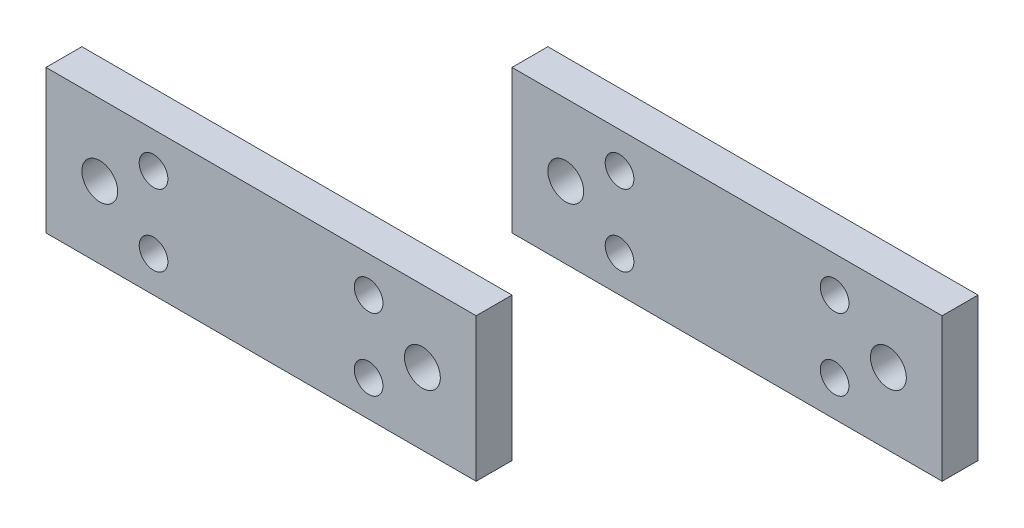
ISO-10303-21;
HEADER;
FILE_DESCRIPTION(('STEP AP214'),'2;1');
FILE_NAME('part.step','',(''),(''),'','','');
FILE_SCHEMA(('AUTOMOTIVE_DESIGN { 1 0 10303 214 1 1 1 1 }'));
ENDSEC;
DATA;
#1=APPLICATION_CONTEXT('core data for automotive mechanical design processes');
#2=APPLICATION_PROTOCOL_DEFINITION('international standard','automotive_design',2000,#1);
#3=PRODUCT_CONTEXT('',#1,'mechanical');
#4=PRODUCT('Part','Part','',(#3));
#5=PRODUCT_RELATED_PRODUCT_CATEGORY('part','',(#4));
#6=PRODUCT_DEFINITION_FORMATION('','',#4);
#7=PRODUCT_DEFINITION_CONTEXT('part definition',#1,'design');
#8=PRODUCT_DEFINITION('design','',#6,#7);
#9=PRODUCT_DEFINITION_SHAPE('','',#8);
#10=(LENGTH_UNIT() NAMED_UNIT(*) SI_UNIT(.MILLI.,.METRE.));
#11=(NAMED_UNIT(*) PLANE_ANGLE_UNIT() SI_UNIT($,.RADIAN.));
#12=(NAMED_UNIT(*) SI_UNIT($,.STERADIAN.) SOLID_ANGLE_UNIT());
#13=UNCERTAINTY_MEASURE_WITH_UNIT(LENGTH_MEASURE(1.E-05),#10,'distance_accuracy_value','');
#14=(GEOMETRIC_REPRESENTATION_CONTEXT(3) GLOBAL_UNCERTAINTY_ASSIGNED_CONTEXT((#13)) GLOBAL_UNIT_ASSIGNED_CONTEXT((#10,
#11,#12)) REPRESENTATION_CONTEXT('',''));
#15=CARTESIAN_POINT('',(0.,0.,0.));
#16=DIRECTION('',(0.,0.,1.));
#17=DIRECTION('',(1.,0.,0.));
#18=AXIS2_PLACEMENT_3D('',#15,#16,#17);
#19=CARTESIAN_POINT('',(0.,0.,2.));
#20=DIRECTION('',(0.,0.,1.));
#21=DIRECTION('',(1.,0.,0.));
#22=AXIS2_PLACEMENT_3D('',#19,#20,#21);
#23=PLANE('',#22);
#24=CARTESIAN_POINT('',(26.4999544809222,6.52037325431698,2.));
#25=DIRECTION('',(0.,0.,1.));
#26=DIRECTION('',(-1.,0.,0.));
#27=AXIS2_PLACEMENT_3D('',#24,#25,#26);
#28=CIRCLE('',#27,1.00000000000001);
#29=CARTESIAN_POINT('',(25.4999544809222,6.52037325431698,2.));
#30=VERTEX_POINT('',#29);
#31=EDGE_CURVE('E145',#30,#30,#28,.T.);
#32=ORIENTED_EDGE('',*,*,#31,.F.);
#33=EDGE_LOOP('',(#32));
#34=FACE_BOUND('',#33,.T.);
#35=CARTESIAN_POINT('',(11.4999544809222,4.52037325431698,2.));
#36=DIRECTION('',(0.,0.,1.));
#37=DIRECTION('',(-1.,0.,0.));
#38=AXIS2_PLACEMENT_3D('',#35,#36,#37);
#39=CIRCLE('',#38,0.800000000000002);
#40=CARTESIAN_POINT('',(10.6999544809222,4.52037325431698,2.));
#41=VERTEX_POINT('',#40);
#42=EDGE_CURVE('E133',#41,#41,#39,.T.);
#43=ORIENTED_EDGE('',*,*,#42,.F.);
#44=EDGE_LOOP('',(#43));
#45=FACE_BOUND('',#44,.T.);
#46=CARTESIAN_POINT('',(11.4999544809222,8.52037325431698,2.));
#47=DIRECTION('',(0.,0.,1.));
#48=DIRECTION('',(1.,0.,0.));
#49=AXIS2_PLACEMENT_3D('',#46,#47,#48);
#50=CIRCLE('',#49,0.800000000000001);
#51=CARTESIAN_POINT('',(12.2999544809222,8.52037325431698,2.));
#52=VERTEX_POINT('',#51);
#53=EDGE_CURVE('E112',#52,#52,#50,.T.);
#54=ORIENTED_EDGE('',*,*,#53,.F.);
#55=EDGE_LOOP('',(#54));
#56=FACE_BOUND('',#55,.T.);
#57=DIRECTION('',(0.,-1.,0.));
#58=VECTOR('',#57,1.);
#59=CARTESIAN_POINT('',(5.4999544809222,10.520373254317,2.));
#60=LINE('',#59,#58);
#61=CARTESIAN_POINT('',(5.4999544809222,10.520373254317,2.));
#62=VERTEX_POINT('',#61);
#63=CARTESIAN_POINT('',(5.4999544809222,2.52037325431698,2.));
#64=VERTEX_POINT('',#63);
#65=EDGE_CURVE('E97',#62,#64,#60,.T.);
#66=ORIENTED_EDGE('',*,*,#65,.T.);
#67=DIRECTION('',(1.,0.,0.));
#68=VECTOR('',#67,1.);
#69=CARTESIAN_POINT('',(5.4999544809222,2.52037325431698,2.));
#70=LINE('',#69,#68);
#71=CARTESIAN_POINT('',(29.4999544809222,2.52037325431698,2.));
#72=VERTEX_POINT('',#71);
#73=EDGE_CURVE('E92',#64,#72,#70,.T.);
#74=ORIENTED_EDGE('',*,*,#73,.T.);
#75=DIRECTION('',(0.,1.,0.));
#76=VECTOR('',#75,1.);
#77=CARTESIAN_POINT('',(29.4999544809222,10.520373254317,2.));
#78=LINE('',#77,#76);
#79=CARTESIAN_POINT('',(29.4999544809222,10.520373254317,2.));
#80=VERTEX_POINT('',#79);
#81=EDGE_CURVE('E95',#72,#80,#78,.T.);
#82=ORIENTED_EDGE('',*,*,#81,.T.);
#83=DIRECTION('',(-1.,0.,0.));
#84=VECTOR('',#83,1.);
#85=CARTESIAN_POINT('',(5.4999544809222,10.520373254317,2.));
#86=LINE('',#85,#84);
#87=EDGE_CURVE('E62',#80,#62,#86,.T.);
#88=ORIENTED_EDGE('',*,*,#87,.T.);
#89=EDGE_LOOP('',(#66,#74,#82,#88));
#90=FACE_BOUND('',#89,.T.);
#91=CARTESIAN_POINT('',(8.4999544809222,6.52037325431698,2.));
#92=DIRECTION('',(0.,0.,1.));
#93=DIRECTION('',(1.,0.,0.));
#94=AXIS2_PLACEMENT_3D('',#91,#92,#93);
#95=CIRCLE('',#94,1.);
#96=CARTESIAN_POINT('',(9.4999544809222,6.52037325431698,2.));
#97=VERTEX_POINT('',#96);
#98=EDGE_CURVE('E127',#97,#97,#95,.T.);
#99=ORIENTED_EDGE('',*,*,#98,.F.);
#100=EDGE_LOOP('',(#99));
#101=FACE_BOUND('',#100,.T.);
#102=CARTESIAN_POINT('',(23.4999544809222,4.52037325431698,2.));
#103=DIRECTION('',(0.,0.,1.));
#104=DIRECTION('',(1.,0.,0.));
#105=AXIS2_PLACEMENT_3D('',#102,#103,#104);
#106=CIRCLE('',#105,0.800000000000002);
#107=CARTESIAN_POINT('',(24.2999544809222,4.52037325431698,2.));
#108=VERTEX_POINT('',#107);
#109=EDGE_CURVE('E139',#108,#108,#106,.T.);
#110=ORIENTED_EDGE('',*,*,#109,.F.);
#111=EDGE_LOOP('',(#110));
#112=FACE_BOUND('',#111,.T.);
#113=CARTESIAN_POINT('',(23.4999544809222,8.52037325431698,2.));
#114=DIRECTION('',(0.,0.,1.));
#115=DIRECTION('',(-1.,0.,0.));
#116=AXIS2_PLACEMENT_3D('',#113,#114,#115);
#117=CIRCLE('',#116,0.800000000000002);
#118=CARTESIAN_POINT('',(22.6999544809222,8.52037325431698,2.));
#119=VERTEX_POINT('',#118);
#120=EDGE_CURVE('E151',#119,#119,#117,.T.);
#121=ORIENTED_EDGE('',*,*,#120,.F.);
#122=EDGE_LOOP('',(#121));
#123=FACE_BOUND('',#122,.T.);
#124=ADVANCED_FACE('F45',(#34,#45,#56,#90,#101,#112,#123),#23,.T.);
#125=CARTESIAN_POINT('',(0.,0.,0.));
#126=DIRECTION('',(0.,0.,1.));
#127=DIRECTION('',(1.,0.,0.));
#128=AXIS2_PLACEMENT_3D('',#125,#126,#127);
#129=PLANE('',#128);
#130=DIRECTION('',(0.,-1.,0.));
#131=VECTOR('',#130,1.);
#132=CARTESIAN_POINT('',(5.4999544809222,10.520373254317,0.));
#133=LINE('',#132,#131);
#134=CARTESIAN_POINT('',(5.4999544809222,10.520373254317,0.));
#135=VERTEX_POINT('',#134);
#136=CARTESIAN_POINT('',(5.4999544809222,2.52037325431698,0.));
#137=VERTEX_POINT('',#136);
#138=EDGE_CURVE('E109',#135,#137,#133,.T.);
#139=ORIENTED_EDGE('',*,*,#138,.F.);
#140=DIRECTION('',(-1.,0.,0.));
#141=VECTOR('',#140,1.);
#142=CARTESIAN_POINT('',(5.4999544809222,10.520373254317,0.));
#143=LINE('',#142,#141);
#144=CARTESIAN_POINT('',(29.4999544809222,10.520373254317,0.));
#145=VERTEX_POINT('',#144);
#146=EDGE_CURVE('E85',#145,#135,#143,.T.);
#147=ORIENTED_EDGE('',*,*,#146,.F.);
#148=DIRECTION('',(0.,1.,0.));
#149=VECTOR('',#148,1.);
#150=CARTESIAN_POINT('',(29.4999544809222,10.520373254317,0.));
#151=LINE('',#150,#149);
#152=CARTESIAN_POINT('',(29.4999544809222,2.52037325431698,0.));
#153=VERTEX_POINT('',#152);
#154=EDGE_CURVE('E79',#153,#145,#151,.T.);
#155=ORIENTED_EDGE('',*,*,#154,.F.);
#156=DIRECTION('',(1.,0.,0.));
#157=VECTOR('',#156,1.);
#158=CARTESIAN_POINT('',(5.4999544809222,2.52037325431698,0.));
#159=LINE('',#158,#157);
#160=EDGE_CURVE('E101',#137,#153,#159,.T.);
#161=ORIENTED_EDGE('',*,*,#160,.F.);
#162=EDGE_LOOP('',(#139,#147,#155,#161));
#163=FACE_BOUND('',#162,.T.);
#164=CARTESIAN_POINT('',(11.4999544809222,8.52037325431698,0.));
#165=DIRECTION('',(0.,0.,1.));
#166=DIRECTION('',(1.,0.,0.));
#167=AXIS2_PLACEMENT_3D('',#164,#165,#166);
#168=CIRCLE('',#167,0.800000000000001);
#169=CARTESIAN_POINT('',(12.2999544809222,8.52037325431698,0.));
#170=VERTEX_POINT('',#169);
#171=EDGE_CURVE('E124',#170,#170,#168,.T.);
#172=ORIENTED_EDGE('',*,*,#171,.T.);
#173=EDGE_LOOP('',(#172));
#174=FACE_BOUND('',#173,.T.);
#175=CARTESIAN_POINT('',(8.4999544809222,6.52037325431698,0.));
#176=DIRECTION('',(0.,0.,1.));
#177=DIRECTION('',(1.,0.,0.));
#178=AXIS2_PLACEMENT_3D('',#175,#176,#177);
#179=CIRCLE('',#178,1.);
#180=CARTESIAN_POINT('',(9.4999544809222,6.52037325431698,0.));
#181=VERTEX_POINT('',#180);
#182=EDGE_CURVE('E130',#181,#181,#179,.T.);
#183=ORIENTED_EDGE('',*,*,#182,.T.);
#184=EDGE_LOOP('',(#183));
#185=FACE_BOUND('',#184,.T.);
#186=CARTESIAN_POINT('',(11.4999544809222,4.52037325431698,0.));
#187=DIRECTION('',(0.,0.,1.));
#188=DIRECTION('',(-1.,0.,0.));
#189=AXIS2_PLACEMENT_3D('',#186,#187,#188);
#190=CIRCLE('',#189,0.800000000000002);
#191=CARTESIAN_POINT('',(10.6999544809222,4.52037325431698,0.));
#192=VERTEX_POINT('',#191);
#193=EDGE_CURVE('E136',#192,#192,#190,.T.);
#194=ORIENTED_EDGE('',*,*,#193,.T.);
#195=EDGE_LOOP('',(#194));
#196=FACE_BOUND('',#195,.T.);
#197=CARTESIAN_POINT('',(23.4999544809222,4.52037325431698,0.));
#198=DIRECTION('',(0.,0.,1.));
#199=DIRECTION('',(1.,0.,0.));
#200=AXIS2_PLACEMENT_3D('',#197,#198,#199);
#201=CIRCLE('',#200,0.800000000000002);
#202=CARTESIAN_POINT('',(24.2999544809222,4.52037325431698,0.));
#203=VERTEX_POINT('',#202);
#204=EDGE_CURVE('E142',#203,#203,#201,.T.);
#205=ORIENTED_EDGE('',*,*,#204,.T.);
#206=EDGE_LOOP('',(#205));
#207=FACE_BOUND('',#206,.T.);
#208=CARTESIAN_POINT('',(26.4999544809222,6.52037325431698,0.));
#209=DIRECTION('',(0.,0.,1.));
#210=DIRECTION('',(-1.,0.,0.));
#211=AXIS2_PLACEMENT_3D('',#208,#209,#210);
#212=CIRCLE('',#211,1.00000000000001);
#213=CARTESIAN_POINT('',(25.4999544809222,6.52037325431698,0.));
#214=VERTEX_POINT('',#213);
#215=EDGE_CURVE('E148',#214,#214,#212,.T.);
#216=ORIENTED_EDGE('',*,*,#215,.T.);
#217=EDGE_LOOP('',(#216));
#218=FACE_BOUND('',#217,.T.);
#219=CARTESIAN_POINT('',(23.4999544809222,8.52037325431698,0.));
#220=DIRECTION('',(0.,0.,1.));
#221=DIRECTION('',(-1.,0.,0.));
#222=AXIS2_PLACEMENT_3D('',#219,#220,#221);
#223=CIRCLE('',#222,0.800000000000002);
#224=CARTESIAN_POINT('',(22.6999544809222,8.52037325431698,0.));
#225=VERTEX_POINT('',#224);
#226=EDGE_CURVE('E154',#225,#225,#223,.T.);
#227=ORIENTED_EDGE('',*,*,#226,.T.);
#228=EDGE_LOOP('',(#227));
#229=FACE_BOUND('',#228,.T.);
#230=ADVANCED_FACE('F120',(#163,#174,#185,#196,#207,#218,#229),#129,.F.);
#231=CARTESIAN_POINT('',(5.4999544809222,10.520373254317,2.));
#232=DIRECTION('',(1.,0.,0.));
#233=DIRECTION('',(0.,1.,0.));
#234=AXIS2_PLACEMENT_3D('',#231,#232,#233);
#235=PLANE('',#234);
#236=ORIENTED_EDGE('',*,*,#138,.T.);
#237=DIRECTION('',(0.,0.,-1.));
#238=VECTOR('',#237,1.);
#239=CARTESIAN_POINT('',(5.4999544809222,2.52037325431698,2.));
#240=LINE('',#239,#238);
#241=EDGE_CURVE('E12',#64,#137,#240,.T.);
#242=ORIENTED_EDGE('',*,*,#241,.F.);
#243=ORIENTED_EDGE('',*,*,#65,.F.);
#244=DIRECTION('',(0.,0.,-1.));
#245=VECTOR('',#244,1.);
#246=CARTESIAN_POINT('',(5.4999544809222,10.520373254317,2.));
#247=LINE('',#246,#245);
#248=EDGE_CURVE('E105',#62,#135,#247,.T.);
#249=ORIENTED_EDGE('',*,*,#248,.T.);
#250=EDGE_LOOP('',(#236,#242,#243,#249));
#251=FACE_BOUND('',#250,.T.);
#252=ADVANCED_FACE('F47',(#251),#235,.F.);
#253=CARTESIAN_POINT('',(5.4999544809222,2.52037325431698,2.));
#254=DIRECTION('',(0.,1.,0.));
#255=DIRECTION('',(-1.,0.,0.));
#256=AXIS2_PLACEMENT_3D('',#253,#254,#255);
#257=PLANE('',#256);
#258=ORIENTED_EDGE('',*,*,#160,.T.);
#259=DIRECTION('',(0.,0.,-1.));
#260=VECTOR('',#259,1.);
#261=CARTESIAN_POINT('',(29.4999544809222,2.52037325431698,2.));
#262=LINE('',#261,#260);
#263=EDGE_CURVE('E54',#72,#153,#262,.T.);
#264=ORIENTED_EDGE('',*,*,#263,.F.);
#265=ORIENTED_EDGE('',*,*,#73,.F.);
#266=ORIENTED_EDGE('',*,*,#241,.T.);
#267=EDGE_LOOP('',(#258,#264,#265,#266));
#268=FACE_BOUND('',#267,.T.);
#269=ADVANCED_FACE('F100',(#268),#257,.F.);
#270=CARTESIAN_POINT('',(29.4999544809222,10.520373254317,2.));
#271=DIRECTION('',(-1.,0.,0.));
#272=DIRECTION('',(0.,0.,1.));
#273=AXIS2_PLACEMENT_3D('',#270,#271,#272);
#274=PLANE('',#273);
#275=ORIENTED_EDGE('',*,*,#154,.T.);
#276=DIRECTION('',(0.,0.,-1.));
#277=VECTOR('',#276,1.);
#278=CARTESIAN_POINT('',(29.4999544809222,10.520373254317,2.));
#279=LINE('',#278,#277);
#280=EDGE_CURVE('E102',#80,#145,#279,.T.);
#281=ORIENTED_EDGE('',*,*,#280,.F.);
#282=ORIENTED_EDGE('',*,*,#81,.F.);
#283=ORIENTED_EDGE('',*,*,#263,.T.);
#284=EDGE_LOOP('',(#275,#281,#282,#283));
#285=FACE_BOUND('',#284,.T.);
#286=ADVANCED_FACE('F103',(#285),#274,.F.);
#287=CARTESIAN_POINT('',(5.4999544809222,10.520373254317,2.));
#288=DIRECTION('',(0.,-1.,0.));
#289=DIRECTION('',(1.,0.,0.));
#290=AXIS2_PLACEMENT_3D('',#287,#288,#289);
#291=PLANE('',#290);
#292=ORIENTED_EDGE('',*,*,#146,.T.);
#293=ORIENTED_EDGE('',*,*,#248,.F.);
#294=ORIENTED_EDGE('',*,*,#87,.F.);
#295=ORIENTED_EDGE('',*,*,#280,.T.);
#296=EDGE_LOOP('',(#292,#293,#294,#295));
#297=FACE_BOUND('',#296,.T.);
#298=ADVANCED_FACE('F117',(#297),#291,.F.);
#299=CARTESIAN_POINT('',(11.4999544809222,8.52037325431698,2.));
#300=DIRECTION('',(0.,0.,-1.));
#301=DIRECTION('',(-1.,0.,0.));
#302=AXIS2_PLACEMENT_3D('',#299,#300,#301);
#303=CYLINDRICAL_SURFACE('',#302,0.800000000000001);
#304=ORIENTED_EDGE('',*,*,#53,.T.);
#305=EDGE_LOOP('',(#304));
#306=FACE_BOUND('',#305,.T.);
#307=ORIENTED_EDGE('',*,*,#171,.F.);
#308=EDGE_LOOP('',(#307));
#309=FACE_BOUND('',#308,.T.);
#310=ADVANCED_FACE('F173',(#306,#309),#303,.F.);
#311=CARTESIAN_POINT('',(8.4999544809222,6.52037325431698,2.));
#312=DIRECTION('',(0.,0.,-1.));
#313=DIRECTION('',(-1.,0.,0.));
#314=AXIS2_PLACEMENT_3D('',#311,#312,#313);
#315=CYLINDRICAL_SURFACE('',#314,1.);
#316=ORIENTED_EDGE('',*,*,#98,.T.);
#317=EDGE_LOOP('',(#316));
#318=FACE_BOUND('',#317,.T.);
#319=ORIENTED_EDGE('',*,*,#182,.F.);
#320=EDGE_LOOP('',(#319));
#321=FACE_BOUND('',#320,.T.);
#322=ADVANCED_FACE('F219',(#318,#321),#315,.F.);
#323=CARTESIAN_POINT('',(11.4999544809222,4.52037325431698,2.));
#324=DIRECTION('',(0.,0.,-1.));
#325=DIRECTION('',(-1.,0.,0.));
#326=AXIS2_PLACEMENT_3D('',#323,#324,#325);
#327=CYLINDRICAL_SURFACE('',#326,0.800000000000002);
#328=ORIENTED_EDGE('',*,*,#42,.T.);
#329=EDGE_LOOP('',(#328));
#330=FACE_BOUND('',#329,.T.);
#331=ORIENTED_EDGE('',*,*,#193,.F.);
#332=EDGE_LOOP('',(#331));
#333=FACE_BOUND('',#332,.T.);
#334=ADVANCED_FACE('F227',(#330,#333),#327,.F.);
#335=CARTESIAN_POINT('',(23.4999544809222,4.52037325431698,2.));
#336=DIRECTION('',(0.,0.,-1.));
#337=DIRECTION('',(-1.,0.,0.));
#338=AXIS2_PLACEMENT_3D('',#335,#336,#337);
#339=CYLINDRICAL_SURFACE('',#338,0.800000000000002);
#340=ORIENTED_EDGE('',*,*,#109,.T.);
#341=EDGE_LOOP('',(#340));
#342=FACE_BOUND('',#341,.T.);
#343=ORIENTED_EDGE('',*,*,#204,.F.);
#344=EDGE_LOOP('',(#343));
#345=FACE_BOUND('',#344,.T.);
#346=ADVANCED_FACE('F235',(#342,#345),#339,.F.);
#347=CARTESIAN_POINT('',(26.4999544809222,6.52037325431698,2.));
#348=DIRECTION('',(0.,0.,-1.));
#349=DIRECTION('',(-1.,0.,0.));
#350=AXIS2_PLACEMENT_3D('',#347,#348,#349);
#351=CYLINDRICAL_SURFACE('',#350,1.00000000000001);
#352=ORIENTED_EDGE('',*,*,#31,.T.);
#353=EDGE_LOOP('',(#352));
#354=FACE_BOUND('',#353,.T.);
#355=ORIENTED_EDGE('',*,*,#215,.F.);
#356=EDGE_LOOP('',(#355));
#357=FACE_BOUND('',#356,.T.);
#358=ADVANCED_FACE('F244',(#354,#357),#351,.F.);
#359=CARTESIAN_POINT('',(23.4999544809222,8.52037325431698,2.));
#360=DIRECTION('',(0.,0.,-1.));
#361=DIRECTION('',(-1.,0.,0.));
#362=AXIS2_PLACEMENT_3D('',#359,#360,#361);
#363=CYLINDRICAL_SURFACE('',#362,0.800000000000002);
#364=ORIENTED_EDGE('',*,*,#120,.T.);
#365=EDGE_LOOP('',(#364));
#366=FACE_BOUND('',#365,.T.);
#367=ORIENTED_EDGE('',*,*,#226,.F.);
#368=EDGE_LOOP('',(#367));
#369=FACE_BOUND('',#368,.T.);
#370=ADVANCED_FACE('F160',(#366,#369),#363,.F.);
#371=CLOSED_SHELL('',(#124,#230,#252,#269,#286,#298,#310,#322,#334,#346,#358,#370));
#372=MANIFOLD_SOLID_BREP('B2',#371);
#373=CARTESIAN_POINT('',(0.,0.,2.));
#374=DIRECTION('',(0.,0.,1.));
#375=DIRECTION('',(1.,0.,0.));
#376=AXIS2_PLACEMENT_3D('',#373,#374,#375);
#377=PLANE('',#376);
#378=CARTESIAN_POINT('',(0.499954480922202,-6.47962674568302,2.));
#379=DIRECTION('',(0.,0.,1.));
#380=DIRECTION('',(-1.,0.,0.));
#381=AXIS2_PLACEMENT_3D('',#378,#379,#380);
#382=CIRCLE('',#381,1.00000000000001);
#383=CARTESIAN_POINT('',(-0.500045519077807,-6.47962674568302,2.));
#384=VERTEX_POINT('',#383);
#385=EDGE_CURVE('E395',#384,#384,#382,.T.);
#386=ORIENTED_EDGE('',*,*,#385,.F.);
#387=EDGE_LOOP('',(#386));
#388=FACE_BOUND('',#387,.T.);
#389=CARTESIAN_POINT('',(-14.5000455190778,-8.47962674568302,2.));
#390=DIRECTION('',(0.,0.,1.));
#391=DIRECTION('',(-1.,0.,0.));
#392=AXIS2_PLACEMENT_3D('',#389,#390,#391);
#393=CIRCLE('',#392,0.800000000000002);
#394=CARTESIAN_POINT('',(-15.3000455190778,-8.47962674568302,2.));
#395=VERTEX_POINT('',#394);
#396=EDGE_CURVE('E383',#395,#395,#393,.T.);
#397=ORIENTED_EDGE('',*,*,#396,.F.);
#398=EDGE_LOOP('',(#397));
#399=FACE_BOUND('',#398,.T.);
#400=CARTESIAN_POINT('',(-14.5000455190778,-4.47962674568302,2.));
#401=DIRECTION('',(0.,0.,1.));
#402=DIRECTION('',(1.,0.,0.));
#403=AXIS2_PLACEMENT_3D('',#400,#401,#402);
#404=CIRCLE('',#403,0.800000000000001);
#405=CARTESIAN_POINT('',(-13.7000455190778,-4.47962674568302,2.));
#406=VERTEX_POINT('',#405);
#407=EDGE_CURVE('E362',#406,#406,#404,.T.);
#408=ORIENTED_EDGE('',*,*,#407,.F.);
#409=EDGE_LOOP('',(#408));
#410=FACE_BOUND('',#409,.T.);
#411=DIRECTION('',(0.,-1.,0.));
#412=VECTOR('',#411,1.);
#413=CARTESIAN_POINT('',(-20.5000455190778,-2.47962674568302,2.));
#414=LINE('',#413,#412);
#415=CARTESIAN_POINT('',(-20.5000455190778,-2.47962674568302,2.));
#416=VERTEX_POINT('',#415);
#417=CARTESIAN_POINT('',(-20.5000455190778,-10.479626745683,2.));
#418=VERTEX_POINT('',#417);
#419=EDGE_CURVE('E347',#416,#418,#414,.T.);
#420=ORIENTED_EDGE('',*,*,#419,.T.);
#421=DIRECTION('',(1.,0.,0.));
#422=VECTOR('',#421,1.);
#423=CARTESIAN_POINT('',(-20.5000455190778,-10.479626745683,2.));
#424=LINE('',#423,#422);
#425=CARTESIAN_POINT('',(3.4999544809222,-10.479626745683,2.));
#426=VERTEX_POINT('',#425);
#427=EDGE_CURVE('E342',#418,#426,#424,.T.);
#428=ORIENTED_EDGE('',*,*,#427,.T.);
#429=DIRECTION('',(0.,1.,0.));
#430=VECTOR('',#429,1.);
#431=CARTESIAN_POINT('',(3.4999544809222,-2.47962674568302,2.));
#432=LINE('',#431,#430);
#433=CARTESIAN_POINT('',(3.4999544809222,-2.47962674568302,2.));
#434=VERTEX_POINT('',#433);
#435=EDGE_CURVE('E345',#426,#434,#432,.T.);
#436=ORIENTED_EDGE('',*,*,#435,.T.);
#437=DIRECTION('',(-1.,0.,0.));
#438=VECTOR('',#437,1.);
#439=CARTESIAN_POINT('',(-20.5000455190778,-2.47962674568302,2.));
#440=LINE('',#439,#438);
#441=EDGE_CURVE('E312',#434,#416,#440,.T.);
#442=ORIENTED_EDGE('',*,*,#441,.T.);
#443=EDGE_LOOP('',(#420,#428,#436,#442));
#444=FACE_BOUND('',#443,.T.);
#445=CARTESIAN_POINT('',(-17.5000455190778,-6.47962674568302,2.));
#446=DIRECTION('',(0.,0.,1.));
#447=DIRECTION('',(1.,0.,0.));
#448=AXIS2_PLACEMENT_3D('',#445,#446,#447);
#449=CIRCLE('',#448,1.);
#450=CARTESIAN_POINT('',(-16.5000455190778,-6.47962674568302,2.));
#451=VERTEX_POINT('',#450);
#452=EDGE_CURVE('E377',#451,#451,#449,.T.);
#453=ORIENTED_EDGE('',*,*,#452,.F.);
#454=EDGE_LOOP('',(#453));
#455=FACE_BOUND('',#454,.T.);
#456=CARTESIAN_POINT('',(-2.50004551907779,-8.47962674568302,2.));
#457=DIRECTION('',(0.,0.,1.));
#458=DIRECTION('',(1.,0.,0.));
#459=AXIS2_PLACEMENT_3D('',#456,#457,#458);
#460=CIRCLE('',#459,0.800000000000002);
#461=CARTESIAN_POINT('',(-1.70004551907779,-8.47962674568302,2.));
#462=VERTEX_POINT('',#461);
#463=EDGE_CURVE('E389',#462,#462,#460,.T.);
#464=ORIENTED_EDGE('',*,*,#463,.F.);
#465=EDGE_LOOP('',(#464));
#466=FACE_BOUND('',#465,.T.);
#467=CARTESIAN_POINT('',(-2.50004551907779,-4.47962674568302,2.));
#468=DIRECTION('',(0.,0.,1.));
#469=DIRECTION('',(-1.,0.,0.));
#470=AXIS2_PLACEMENT_3D('',#467,#468,#469);
#471=CIRCLE('',#470,0.800000000000002);
#472=CARTESIAN_POINT('',(-3.3000455190778,-4.47962674568302,2.));
#473=VERTEX_POINT('',#472);
#474=EDGE_CURVE('E401',#473,#473,#471,.T.);
#475=ORIENTED_EDGE('',*,*,#474,.F.);
#476=EDGE_LOOP('',(#475));
#477=FACE_BOUND('',#476,.T.);
#478=ADVANCED_FACE('F295',(#388,#399,#410,#444,#455,#466,#477),#377,.T.);
#479=CARTESIAN_POINT('',(0.,0.,0.));
#480=DIRECTION('',(0.,0.,1.));
#481=DIRECTION('',(1.,0.,0.));
#482=AXIS2_PLACEMENT_3D('',#479,#480,#481);
#483=PLANE('',#482);
#484=DIRECTION('',(0.,-1.,0.));
#485=VECTOR('',#484,1.);
#486=CARTESIAN_POINT('',(-20.5000455190778,-2.47962674568302,0.));
#487=LINE('',#486,#485);
#488=CARTESIAN_POINT('',(-20.5000455190778,-2.47962674568302,0.));
#489=VERTEX_POINT('',#488);
#490=CARTESIAN_POINT('',(-20.5000455190778,-10.479626745683,0.));
#491=VERTEX_POINT('',#490);
#492=EDGE_CURVE('E359',#489,#491,#487,.T.);
#493=ORIENTED_EDGE('',*,*,#492,.F.);
#494=DIRECTION('',(-1.,0.,0.));
#495=VECTOR('',#494,1.);
#496=CARTESIAN_POINT('',(-20.5000455190778,-2.47962674568302,0.));
#497=LINE('',#496,#495);
#498=CARTESIAN_POINT('',(3.4999544809222,-2.47962674568302,0.));
#499=VERTEX_POINT('',#498);
#500=EDGE_CURVE('E335',#499,#489,#497,.T.);
#501=ORIENTED_EDGE('',*,*,#500,.F.);
#502=DIRECTION('',(0.,1.,0.));
#503=VECTOR('',#502,1.);
#504=CARTESIAN_POINT('',(3.4999544809222,-2.47962674568302,0.));
#505=LINE('',#504,#503);
#506=CARTESIAN_POINT('',(3.4999544809222,-10.479626745683,0.));
#507=VERTEX_POINT('',#506);
#508=EDGE_CURVE('E329',#507,#499,#505,.T.);
#509=ORIENTED_EDGE('',*,*,#508,.F.);
#510=DIRECTION('',(1.,0.,0.));
#511=VECTOR('',#510,1.);
#512=CARTESIAN_POINT('',(-20.5000455190778,-10.479626745683,0.));
#513=LINE('',#512,#511);
#514=EDGE_CURVE('E351',#491,#507,#513,.T.);
#515=ORIENTED_EDGE('',*,*,#514,.F.);
#516=EDGE_LOOP('',(#493,#501,#509,#515));
#517=FACE_BOUND('',#516,.T.);
#518=CARTESIAN_POINT('',(-14.5000455190778,-4.47962674568302,0.));
#519=DIRECTION('',(0.,0.,1.));
#520=DIRECTION('',(1.,0.,0.));
#521=AXIS2_PLACEMENT_3D('',#518,#519,#520);
#522=CIRCLE('',#521,0.800000000000001);
#523=CARTESIAN_POINT('',(-13.7000455190778,-4.47962674568302,0.));
#524=VERTEX_POINT('',#523);
#525=EDGE_CURVE('E374',#524,#524,#522,.T.);
#526=ORIENTED_EDGE('',*,*,#525,.T.);
#527=EDGE_LOOP('',(#526));
#528=FACE_BOUND('',#527,.T.);
#529=CARTESIAN_POINT('',(-17.5000455190778,-6.47962674568302,0.));
#530=DIRECTION('',(0.,0.,1.));
#531=DIRECTION('',(1.,0.,0.));
#532=AXIS2_PLACEMENT_3D('',#529,#530,#531);
#533=CIRCLE('',#532,1.);
#534=CARTESIAN_POINT('',(-16.5000455190778,-6.47962674568302,0.));
#535=VERTEX_POINT('',#534);
#536=EDGE_CURVE('E380',#535,#535,#533,.T.);
#537=ORIENTED_EDGE('',*,*,#536,.T.);
#538=EDGE_LOOP('',(#537));
#539=FACE_BOUND('',#538,.T.);
#540=CARTESIAN_POINT('',(-14.5000455190778,-8.47962674568302,0.));
#541=DIRECTION('',(0.,0.,1.));
#542=DIRECTION('',(-1.,0.,0.));
#543=AXIS2_PLACEMENT_3D('',#540,#541,#542);
#544=CIRCLE('',#543,0.800000000000002);
#545=CARTESIAN_POINT('',(-15.3000455190778,-8.47962674568302,0.));
#546=VERTEX_POINT('',#545);
#547=EDGE_CURVE('E386',#546,#546,#544,.T.);
#548=ORIENTED_EDGE('',*,*,#547,.T.);
#549=EDGE_LOOP('',(#548));
#550=FACE_BOUND('',#549,.T.);
#551=CARTESIAN_POINT('',(-2.50004551907779,-8.47962674568302,0.));
#552=DIRECTION('',(0.,0.,1.));
#553=DIRECTION('',(1.,0.,0.));
#554=AXIS2_PLACEMENT_3D('',#551,#552,#553);
#555=CIRCLE('',#554,0.800000000000002);
#556=CARTESIAN_POINT('',(-1.70004551907779,-8.47962674568302,0.));
#557=VERTEX_POINT('',#556);
#558=EDGE_CURVE('E392',#557,#557,#555,.T.);
#559=ORIENTED_EDGE('',*,*,#558,.T.);
#560=EDGE_LOOP('',(#559));
#561=FACE_BOUND('',#560,.T.);
#562=CARTESIAN_POINT('',(0.499954480922202,-6.47962674568302,0.));
#563=DIRECTION('',(0.,0.,1.));
#564=DIRECTION('',(-1.,0.,0.));
#565=AXIS2_PLACEMENT_3D('',#562,#563,#564);
#566=CIRCLE('',#565,1.00000000000001);
#567=CARTESIAN_POINT('',(-0.500045519077807,-6.47962674568302,0.));
#568=VERTEX_POINT('',#567);
#569=EDGE_CURVE('E398',#568,#568,#566,.T.);
#570=ORIENTED_EDGE('',*,*,#569,.T.);
#571=EDGE_LOOP('',(#570));
#572=FACE_BOUND('',#571,.T.);
#573=CARTESIAN_POINT('',(-2.50004551907779,-4.47962674568302,0.));
#574=DIRECTION('',(0.,0.,1.));
#575=DIRECTION('',(-1.,0.,0.));
#576=AXIS2_PLACEMENT_3D('',#573,#574,#575);
#577=CIRCLE('',#576,0.800000000000002);
#578=CARTESIAN_POINT('',(-3.3000455190778,-4.47962674568302,0.));
#579=VERTEX_POINT('',#578);
#580=EDGE_CURVE('E404',#579,#579,#577,.T.);
#581=ORIENTED_EDGE('',*,*,#580,.T.);
#582=EDGE_LOOP('',(#581));
#583=FACE_BOUND('',#582,.T.);
#584=ADVANCED_FACE('F370',(#517,#528,#539,#550,#561,#572,#583),#483,.F.);
#585=CARTESIAN_POINT('',(-20.5000455190778,-2.47962674568302,2.));
#586=DIRECTION('',(1.,0.,0.));
#587=DIRECTION('',(0.,0.,-1.));
#588=AXIS2_PLACEMENT_3D('',#585,#586,#587);
#589=PLANE('',#588);
#590=ORIENTED_EDGE('',*,*,#492,.T.);
#591=DIRECTION('',(0.,0.,-1.));
#592=VECTOR('',#591,1.);
#593=CARTESIAN_POINT('',(-20.5000455190778,-10.479626745683,2.));
#594=LINE('',#593,#592);
#595=EDGE_CURVE('E43',#418,#491,#594,.T.);
#596=ORIENTED_EDGE('',*,*,#595,.F.);
#597=ORIENTED_EDGE('',*,*,#419,.F.);
#598=DIRECTION('',(0.,0.,-1.));
#599=VECTOR('',#598,1.);
#600=CARTESIAN_POINT('',(-20.5000455190778,-2.47962674568302,2.));
#601=LINE('',#600,#599);
#602=EDGE_CURVE('E355',#416,#489,#601,.T.);
#603=ORIENTED_EDGE('',*,*,#602,.T.);
#604=EDGE_LOOP('',(#590,#596,#597,#603));
#605=FACE_BOUND('',#604,.T.);
#606=ADVANCED_FACE('F297',(#605),#589,.F.);
#607=CARTESIAN_POINT('',(-20.5000455190778,-10.479626745683,2.));
#608=DIRECTION('',(0.,1.,0.));
#609=DIRECTION('',(0.,0.,1.));
#610=AXIS2_PLACEMENT_3D('',#607,#608,#609);
#611=PLANE('',#610);
#612=ORIENTED_EDGE('',*,*,#514,.T.);
#613=DIRECTION('',(0.,0.,-1.));
#614=VECTOR('',#613,1.);
#615=CARTESIAN_POINT('',(3.4999544809222,-10.479626745683,2.));
#616=LINE('',#615,#614);
#617=EDGE_CURVE('E304',#426,#507,#616,.T.);
#618=ORIENTED_EDGE('',*,*,#617,.F.);
#619=ORIENTED_EDGE('',*,*,#427,.F.);
#620=ORIENTED_EDGE('',*,*,#595,.T.);
#621=EDGE_LOOP('',(#612,#618,#619,#620));
#622=FACE_BOUND('',#621,.T.);
#623=ADVANCED_FACE('F350',(#622),#611,.F.);
#624=CARTESIAN_POINT('',(3.4999544809222,-2.47962674568302,2.));
#625=DIRECTION('',(-1.,0.,0.));
#626=DIRECTION('',(0.,0.,1.));
#627=AXIS2_PLACEMENT_3D('',#624,#625,#626);
#628=PLANE('',#627);
#629=ORIENTED_EDGE('',*,*,#508,.T.);
#630=DIRECTION('',(0.,0.,-1.));
#631=VECTOR('',#630,1.);
#632=CARTESIAN_POINT('',(3.4999544809222,-2.47962674568302,2.));
#633=LINE('',#632,#631);
#634=EDGE_CURVE('E352',#434,#499,#633,.T.);
#635=ORIENTED_EDGE('',*,*,#634,.F.);
#636=ORIENTED_EDGE('',*,*,#435,.F.);
#637=ORIENTED_EDGE('',*,*,#617,.T.);
#638=EDGE_LOOP('',(#629,#635,#636,#637));
#639=FACE_BOUND('',#638,.T.);
#640=ADVANCED_FACE('F353',(#639),#628,.F.);
#641=CARTESIAN_POINT('',(-20.5000455190778,-2.47962674568302,2.));
#642=DIRECTION('',(0.,-1.,0.));
#643=DIRECTION('',(0.,0.,-1.));
#644=AXIS2_PLACEMENT_3D('',#641,#642,#643);
#645=PLANE('',#644);
#646=ORIENTED_EDGE('',*,*,#500,.T.);
#647=ORIENTED_EDGE('',*,*,#602,.F.);
#648=ORIENTED_EDGE('',*,*,#441,.F.);
#649=ORIENTED_EDGE('',*,*,#634,.T.);
#650=EDGE_LOOP('',(#646,#647,#648,#649));
#651=FACE_BOUND('',#650,.T.);
#652=ADVANCED_FACE('F367',(#651),#645,.F.);
#653=CARTESIAN_POINT('',(-14.5000455190778,-4.47962674568302,2.));
#654=DIRECTION('',(0.,0.,-1.));
#655=DIRECTION('',(-1.,0.,0.));
#656=AXIS2_PLACEMENT_3D('',#653,#654,#655);
#657=CYLINDRICAL_SURFACE('',#656,0.800000000000001);
#658=ORIENTED_EDGE('',*,*,#407,.T.);
#659=EDGE_LOOP('',(#658));
#660=FACE_BOUND('',#659,.T.);
#661=ORIENTED_EDGE('',*,*,#525,.F.);
#662=EDGE_LOOP('',(#661));
#663=FACE_BOUND('',#662,.T.);
#664=ADVANCED_FACE('F423',(#660,#663),#657,.F.);
#665=CARTESIAN_POINT('',(-17.5000455190778,-6.47962674568302,2.));
#666=DIRECTION('',(0.,0.,-1.));
#667=DIRECTION('',(-1.,0.,0.));
#668=AXIS2_PLACEMENT_3D('',#665,#666,#667);
#669=CYLINDRICAL_SURFACE('',#668,1.);
#670=ORIENTED_EDGE('',*,*,#452,.T.);
#671=EDGE_LOOP('',(#670));
#672=FACE_BOUND('',#671,.T.);
#673=ORIENTED_EDGE('',*,*,#536,.F.);
#674=EDGE_LOOP('',(#673));
#675=FACE_BOUND('',#674,.T.);
#676=ADVANCED_FACE('F469',(#672,#675),#669,.F.);
#677=CARTESIAN_POINT('',(-14.5000455190778,-8.47962674568302,2.));
#678=DIRECTION('',(0.,0.,-1.));
#679=DIRECTION('',(-1.,0.,0.));
#680=AXIS2_PLACEMENT_3D('',#677,#678,#679);
#681=CYLINDRICAL_SURFACE('',#680,0.800000000000002);
#682=ORIENTED_EDGE('',*,*,#396,.T.);
#683=EDGE_LOOP('',(#682));
#684=FACE_BOUND('',#683,.T.);
#685=ORIENTED_EDGE('',*,*,#547,.F.);
#686=EDGE_LOOP('',(#685));
#687=FACE_BOUND('',#686,.T.);
#688=ADVANCED_FACE('F477',(#684,#687),#681,.F.);
#689=CARTESIAN_POINT('',(-2.50004551907779,-8.47962674568302,2.));
#690=DIRECTION('',(0.,0.,-1.));
#691=DIRECTION('',(-1.,0.,0.));
#692=AXIS2_PLACEMENT_3D('',#689,#690,#691);
#693=CYLINDRICAL_SURFACE('',#692,0.800000000000002);
#694=ORIENTED_EDGE('',*,*,#463,.T.);
#695=EDGE_LOOP('',(#694));
#696=FACE_BOUND('',#695,.T.);
#697=ORIENTED_EDGE('',*,*,#558,.F.);
#698=EDGE_LOOP('',(#697));
#699=FACE_BOUND('',#698,.T.);
#700=ADVANCED_FACE('F485',(#696,#699),#693,.F.);
#701=CARTESIAN_POINT('',(0.499954480922202,-6.47962674568302,2.));
#702=DIRECTION('',(0.,0.,-1.));
#703=DIRECTION('',(-1.,0.,0.));
#704=AXIS2_PLACEMENT_3D('',#701,#702,#703);
#705=CYLINDRICAL_SURFACE('',#704,1.00000000000001);
#706=ORIENTED_EDGE('',*,*,#385,.T.);
#707=EDGE_LOOP('',(#706));
#708=FACE_BOUND('',#707,.T.);
#709=ORIENTED_EDGE('',*,*,#569,.F.);
#710=EDGE_LOOP('',(#709));
#711=FACE_BOUND('',#710,.T.);
#712=ADVANCED_FACE('F494',(#708,#711),#705,.F.);
#713=CARTESIAN_POINT('',(-2.50004551907779,-4.47962674568302,2.));
#714=DIRECTION('',(0.,0.,-1.));
#715=DIRECTION('',(-1.,0.,0.));
#716=AXIS2_PLACEMENT_3D('',#713,#714,#715);
#717=CYLINDRICAL_SURFACE('',#716,0.800000000000002);
#718=ORIENTED_EDGE('',*,*,#474,.T.);
#719=EDGE_LOOP('',(#718));
#720=FACE_BOUND('',#719,.T.);
#721=ORIENTED_EDGE('',*,*,#580,.F.);
#722=EDGE_LOOP('',(#721));
#723=FACE_BOUND('',#722,.T.);
#724=ADVANCED_FACE('F410',(#720,#723),#717,.F.);
#725=CLOSED_SHELL('',(#478,#584,#606,#623,#640,#652,#664,#676,#688,#700,#712,#724));
#726=MANIFOLD_SOLID_BREP('B6',#725);
#727=ADVANCED_BREP_SHAPE_REPRESENTATION('',(#18,#372,#726),#14);
#728=SHAPE_DEFINITION_REPRESENTATION(#9,#727);
ENDSEC;
END-ISO-10303-21;
